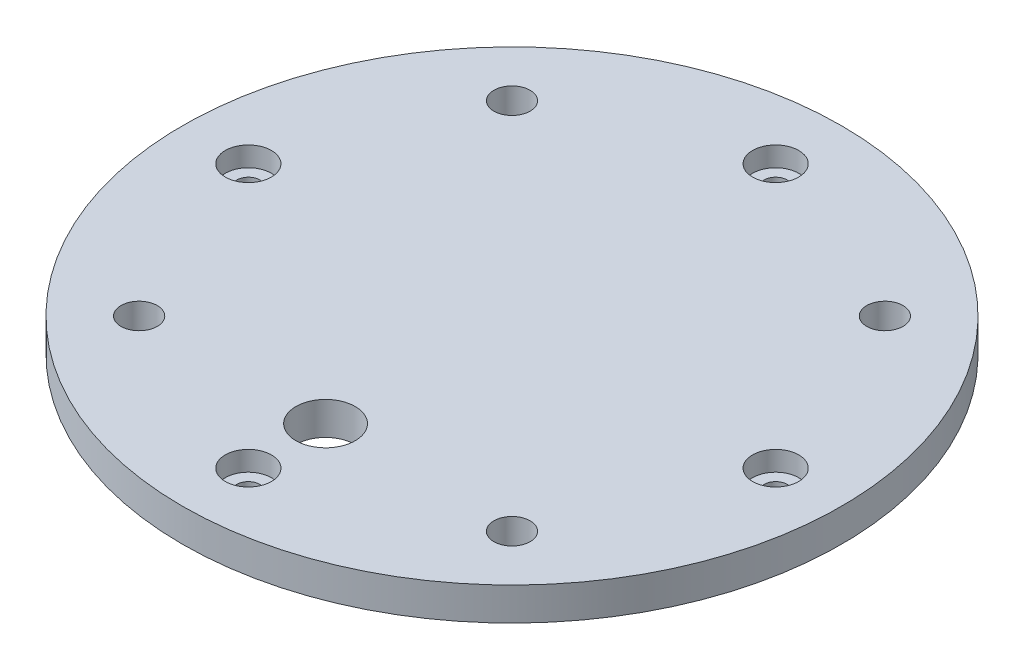
ISO-10303-21;
HEADER;
FILE_DESCRIPTION(('STEP AP214'),'2;1');
FILE_NAME('part.step','',(''),(''),'','','');
FILE_SCHEMA(('AUTOMOTIVE_DESIGN { 1 0 10303 214 1 1 1 1 }'));
ENDSEC;
DATA;
#1=APPLICATION_CONTEXT('core data for automotive mechanical design processes');
#2=APPLICATION_PROTOCOL_DEFINITION('international standard','automotive_design',2000,#1);
#3=PRODUCT_CONTEXT('',#1,'mechanical');
#4=PRODUCT('Part','Part','',(#3));
#5=PRODUCT_RELATED_PRODUCT_CATEGORY('part','',(#4));
#6=PRODUCT_DEFINITION_FORMATION('','',#4);
#7=PRODUCT_DEFINITION_CONTEXT('part definition',#1,'design');
#8=PRODUCT_DEFINITION('design','',#6,#7);
#9=PRODUCT_DEFINITION_SHAPE('','',#8);
#10=(LENGTH_UNIT() NAMED_UNIT(*) SI_UNIT(.MILLI.,.METRE.));
#11=(NAMED_UNIT(*) PLANE_ANGLE_UNIT() SI_UNIT($,.RADIAN.));
#12=(NAMED_UNIT(*) SI_UNIT($,.STERADIAN.) SOLID_ANGLE_UNIT());
#13=UNCERTAINTY_MEASURE_WITH_UNIT(LENGTH_MEASURE(1.E-05),#10,'distance_accuracy_value','');
#14=(GEOMETRIC_REPRESENTATION_CONTEXT(3) GLOBAL_UNCERTAINTY_ASSIGNED_CONTEXT((#13)) GLOBAL_UNIT_ASSIGNED_CONTEXT((#10,
#11,#12)) REPRESENTATION_CONTEXT('',''));
#15=CARTESIAN_POINT('',(0.,0.,0.));
#16=DIRECTION('',(0.,0.,1.));
#17=DIRECTION('',(1.,0.,0.));
#18=AXIS2_PLACEMENT_3D('',#15,#16,#17);
#19=CARTESIAN_POINT('',(-39.9999999999989,-7.,1.13441908361787E-12));
#20=DIRECTION('',(0.,1.,0.));
#21=DIRECTION('',(0.,0.,1.));
#22=AXIS2_PLACEMENT_3D('',#19,#20,#21);
#23=CYLINDRICAL_SURFACE('',#22,1.75000000000181);
#24=CARTESIAN_POINT('',(-39.9999999999989,0.,1.13441908361787E-12));
#25=DIRECTION('',(0.,1.,0.));
#26=DIRECTION('',(0.,0.,1.));
#27=AXIS2_PLACEMENT_3D('',#24,#25,#26);
#28=CIRCLE('',#27,1.75000000000181);
#29=CARTESIAN_POINT('',(-39.9999999999989,0.,1.75000000000295));
#30=VERTEX_POINT('',#29);
#31=EDGE_CURVE('E54',#30,#30,#28,.T.);
#32=ORIENTED_EDGE('',*,*,#31,.F.);
#33=EDGE_LOOP('',(#32));
#34=FACE_BOUND('',#33,.T.);
#35=CARTESIAN_POINT('',(-39.9999999999989,2.,1.13441908361787E-12));
#36=DIRECTION('',(0.,1.,0.));
#37=DIRECTION('',(0.,0.,1.));
#38=AXIS2_PLACEMENT_3D('',#35,#36,#37);
#39=CIRCLE('',#38,1.75000000000181);
#40=CARTESIAN_POINT('',(-39.9999999999989,2.,1.75000000000295));
#41=VERTEX_POINT('',#40);
#42=EDGE_CURVE('E58',#41,#41,#39,.F.);
#43=ORIENTED_EDGE('',*,*,#42,.F.);
#44=EDGE_LOOP('',(#43));
#45=FACE_BOUND('',#44,.T.);
#46=ADVANCED_FACE('F35',(#34,#45),#23,.F.);
#47=CARTESIAN_POINT('',(2.25904099284255E-12,-7.,40.));
#48=DIRECTION('',(0.,1.,0.));
#49=DIRECTION('',(0.,0.,1.));
#50=AXIS2_PLACEMENT_3D('',#47,#48,#49);
#51=CYLINDRICAL_SURFACE('',#50,1.75000000000243);
#52=CARTESIAN_POINT('',(2.25904099284255E-12,0.,40.));
#53=DIRECTION('',(0.,1.,0.));
#54=DIRECTION('',(0.,0.,1.));
#55=AXIS2_PLACEMENT_3D('',#52,#53,#54);
#56=CIRCLE('',#55,1.75000000000243);
#57=CARTESIAN_POINT('',(2.25904099284255E-12,0.,41.7500000000024));
#58=VERTEX_POINT('',#57);
#59=EDGE_CURVE('E57',#58,#58,#56,.T.);
#60=ORIENTED_EDGE('',*,*,#59,.F.);
#61=EDGE_LOOP('',(#60));
#62=FACE_BOUND('',#61,.T.);
#63=CARTESIAN_POINT('',(2.25904099284255E-12,2.,40.));
#64=DIRECTION('',(0.,1.,0.));
#65=DIRECTION('',(0.,0.,1.));
#66=AXIS2_PLACEMENT_3D('',#63,#64,#65);
#67=CIRCLE('',#66,1.75000000000243);
#68=CARTESIAN_POINT('',(2.25904099284255E-12,2.,41.7500000000024));
#69=VERTEX_POINT('',#68);
#70=EDGE_CURVE('E73',#69,#69,#67,.F.);
#71=ORIENTED_EDGE('',*,*,#70,.F.);
#72=EDGE_LOOP('',(#71));
#73=FACE_BOUND('',#72,.T.);
#74=ADVANCED_FACE('F148',(#62,#73),#51,.F.);
#75=CARTESIAN_POINT('',(40.0000000000011,-7.,-1.12952049642128E-12));
#76=DIRECTION('',(0.,1.,0.));
#77=DIRECTION('',(0.,0.,1.));
#78=AXIS2_PLACEMENT_3D('',#75,#76,#77);
#79=CYLINDRICAL_SURFACE('',#78,1.75000000000088);
#80=CARTESIAN_POINT('',(40.0000000000011,0.,-1.12952049642128E-12));
#81=DIRECTION('',(0.,1.,0.));
#82=DIRECTION('',(0.,0.,1.));
#83=AXIS2_PLACEMENT_3D('',#80,#81,#82);
#84=CIRCLE('',#83,1.75000000000088);
#85=CARTESIAN_POINT('',(40.0000000000011,0.,1.74999999999975));
#86=VERTEX_POINT('',#85);
#87=EDGE_CURVE('E61',#86,#86,#84,.T.);
#88=ORIENTED_EDGE('',*,*,#87,.F.);
#89=EDGE_LOOP('',(#88));
#90=FACE_BOUND('',#89,.T.);
#91=CARTESIAN_POINT('',(40.0000000000011,2.,-1.12952049642128E-12));
#92=DIRECTION('',(0.,1.,0.));
#93=DIRECTION('',(0.,0.,1.));
#94=AXIS2_PLACEMENT_3D('',#91,#92,#93);
#95=CIRCLE('',#94,1.75000000000088);
#96=CARTESIAN_POINT('',(40.0000000000011,2.,1.74999999999975));
#97=VERTEX_POINT('',#96);
#98=EDGE_CURVE('E69',#97,#97,#95,.F.);
#99=ORIENTED_EDGE('',*,*,#98,.F.);
#100=EDGE_LOOP('',(#99));
#101=FACE_BOUND('',#100,.T.);
#102=ADVANCED_FACE('F154',(#90,#101),#79,.F.);
#103=CARTESIAN_POINT('',(0.,-7.,-40.));
#104=DIRECTION('',(0.,1.,0.));
#105=DIRECTION('',(0.,0.,1.));
#106=AXIS2_PLACEMENT_3D('',#103,#104,#105);
#107=CYLINDRICAL_SURFACE('',#106,1.75);
#108=CARTESIAN_POINT('',(0.,0.,-40.));
#109=DIRECTION('',(0.,1.,0.));
#110=DIRECTION('',(0.,0.,1.));
#111=AXIS2_PLACEMENT_3D('',#108,#109,#110);
#112=CIRCLE('',#111,1.75);
#113=CARTESIAN_POINT('',(0.,0.,-38.25));
#114=VERTEX_POINT('',#113);
#115=EDGE_CURVE('E48',#114,#114,#112,.T.);
#116=ORIENTED_EDGE('',*,*,#115,.F.);
#117=EDGE_LOOP('',(#116));
#118=FACE_BOUND('',#117,.T.);
#119=CARTESIAN_POINT('',(0.,2.,-40.));
#120=DIRECTION('',(0.,1.,0.));
#121=DIRECTION('',(0.,0.,1.));
#122=AXIS2_PLACEMENT_3D('',#119,#120,#121);
#123=CIRCLE('',#122,1.75);
#124=CARTESIAN_POINT('',(0.,2.,-38.25));
#125=VERTEX_POINT('',#124);
#126=EDGE_CURVE('E66',#125,#125,#123,.F.);
#127=ORIENTED_EDGE('',*,*,#126,.F.);
#128=EDGE_LOOP('',(#127));
#129=FACE_BOUND('',#128,.T.);
#130=ADVANCED_FACE('F204',(#118,#129),#107,.F.);
#131=CARTESIAN_POINT('',(0.,5.,0.));
#132=DIRECTION('',(0.,-1.,0.));
#133=DIRECTION('',(0.,0.,-1.));
#134=AXIS2_PLACEMENT_3D('',#131,#132,#133);
#135=CYLINDRICAL_SURFACE('',#134,50.);
#136=CARTESIAN_POINT('',(0.,5.,0.));
#137=DIRECTION('',(0.,1.,0.));
#138=DIRECTION('',(0.,0.,1.));
#139=AXIS2_PLACEMENT_3D('',#136,#137,#138);
#140=CIRCLE('',#139,50.);
#141=CARTESIAN_POINT('',(0.,5.,50.));
#142=VERTEX_POINT('',#141);
#143=EDGE_CURVE('E10',#142,#142,#140,.T.);
#144=ORIENTED_EDGE('',*,*,#143,.F.);
#145=EDGE_LOOP('',(#144));
#146=FACE_BOUND('',#145,.T.);
#147=CARTESIAN_POINT('',(0.,0.,0.));
#148=DIRECTION('',(0.,1.,0.));
#149=DIRECTION('',(0.,0.,1.));
#150=AXIS2_PLACEMENT_3D('',#147,#148,#149);
#151=CIRCLE('',#150,50.);
#152=CARTESIAN_POINT('',(0.,0.,50.));
#153=VERTEX_POINT('',#152);
#154=EDGE_CURVE('E43',#153,#153,#151,.T.);
#155=ORIENTED_EDGE('',*,*,#154,.T.);
#156=EDGE_LOOP('',(#155));
#157=FACE_BOUND('',#156,.T.);
#158=ADVANCED_FACE('F37',(#146,#157),#135,.T.);
#159=CARTESIAN_POINT('',(0.,5.,0.));
#160=DIRECTION('',(0.,1.,0.));
#161=DIRECTION('',(0.,0.,1.));
#162=AXIS2_PLACEMENT_3D('',#159,#160,#161);
#163=PLANE('',#162);
#164=CARTESIAN_POINT('',(1.3765030781876E-12,5.,28.2842712474618));
#165=DIRECTION('',(0.,1.,0.));
#166=DIRECTION('',(0.,0.,1.));
#167=AXIS2_PLACEMENT_3D('',#164,#165,#166);
#168=CIRCLE('',#167,4.5);
#169=CARTESIAN_POINT('',(1.3765030781876E-12,5.,32.7842712474618));
#170=VERTEX_POINT('',#169);
#171=EDGE_CURVE('E127',#170,#170,#168,.T.);
#172=ORIENTED_EDGE('',*,*,#171,.F.);
#173=EDGE_LOOP('',(#172));
#174=FACE_BOUND('',#173,.T.);
#175=CARTESIAN_POINT('',(-28.2842712474616,5.,-28.2842712474622));
#176=DIRECTION('',(0.,1.,0.));
#177=DIRECTION('',(0.,0.,1.));
#178=AXIS2_PLACEMENT_3D('',#175,#176,#177);
#179=CIRCLE('',#178,2.75);
#180=CARTESIAN_POINT('',(-28.2842712474616,5.,-25.5342712474622));
#181=VERTEX_POINT('',#180);
#182=EDGE_CURVE('E119',#181,#181,#179,.T.);
#183=ORIENTED_EDGE('',*,*,#182,.F.);
#184=EDGE_LOOP('',(#183));
#185=FACE_BOUND('',#184,.T.);
#186=CARTESIAN_POINT('',(-28.2842712474621,5.,28.2842712474617));
#187=DIRECTION('',(0.,1.,0.));
#188=DIRECTION('',(0.,0.,1.));
#189=AXIS2_PLACEMENT_3D('',#186,#187,#188);
#190=CIRCLE('',#189,2.75);
#191=CARTESIAN_POINT('',(-28.2842712474621,5.,31.0342712474616));
#192=VERTEX_POINT('',#191);
#193=EDGE_CURVE('E122',#192,#192,#190,.T.);
#194=ORIENTED_EDGE('',*,*,#193,.F.);
#195=EDGE_LOOP('',(#194));
#196=FACE_BOUND('',#195,.T.);
#197=CARTESIAN_POINT('',(28.2842712474618,5.,28.284271247462));
#198=DIRECTION('',(0.,1.,0.));
#199=DIRECTION('',(0.,0.,1.));
#200=AXIS2_PLACEMENT_3D('',#197,#198,#199);
#201=CIRCLE('',#200,2.75);
#202=CARTESIAN_POINT('',(28.2842712474618,5.,31.034271247462));
#203=VERTEX_POINT('',#202);
#204=EDGE_CURVE('E118',#203,#203,#201,.T.);
#205=ORIENTED_EDGE('',*,*,#204,.F.);
#206=EDGE_LOOP('',(#205));
#207=FACE_BOUND('',#206,.T.);
#208=CARTESIAN_POINT('',(28.2842712474619,5.,-28.2842712474619));
#209=DIRECTION('',(0.,1.,0.));
#210=DIRECTION('',(0.,0.,1.));
#211=AXIS2_PLACEMENT_3D('',#208,#209,#210);
#212=CIRCLE('',#211,2.75);
#213=CARTESIAN_POINT('',(28.2842712474619,5.,-25.5342712474619));
#214=VERTEX_POINT('',#213);
#215=EDGE_CURVE('E82',#214,#214,#212,.T.);
#216=ORIENTED_EDGE('',*,*,#215,.F.);
#217=EDGE_LOOP('',(#216));
#218=FACE_BOUND('',#217,.T.);
#219=CARTESIAN_POINT('',(0.,5.,-40.0000000000001));
#220=DIRECTION('',(0.,1.,0.));
#221=DIRECTION('',(0.,0.,1.));
#222=AXIS2_PLACEMENT_3D('',#219,#220,#221);
#223=CIRCLE('',#222,3.5);
#224=CARTESIAN_POINT('',(0.,5.,-36.5000000000001));
#225=VERTEX_POINT('',#224);
#226=EDGE_CURVE('E111',#225,#225,#223,.T.);
#227=ORIENTED_EDGE('',*,*,#226,.F.);
#228=EDGE_LOOP('',(#227));
#229=FACE_BOUND('',#228,.T.);
#230=CARTESIAN_POINT('',(40.0000000000013,5.,-1.10703848017262E-12));
#231=DIRECTION('',(0.,1.,0.));
#232=DIRECTION('',(0.,0.,1.));
#233=AXIS2_PLACEMENT_3D('',#230,#231,#232);
#234=CIRCLE('',#233,3.5);
#235=CARTESIAN_POINT('',(40.0000000000013,5.,3.49999999999889));
#236=VERTEX_POINT('',#235);
#237=EDGE_CURVE('E108',#236,#236,#234,.T.);
#238=ORIENTED_EDGE('',*,*,#237,.F.);
#239=EDGE_LOOP('',(#238));
#240=FACE_BOUND('',#239,.T.);
#241=CARTESIAN_POINT('',(2.21407696034524E-12,5.,40.0000000000001));
#242=DIRECTION('',(0.,1.,0.));
#243=DIRECTION('',(0.,0.,1.));
#244=AXIS2_PLACEMENT_3D('',#241,#242,#243);
#245=CIRCLE('',#244,3.5);
#246=CARTESIAN_POINT('',(2.21407696034524E-12,5.,43.5000000000001));
#247=VERTEX_POINT('',#246);
#248=EDGE_CURVE('E100',#247,#247,#245,.T.);
#249=ORIENTED_EDGE('',*,*,#248,.F.);
#250=EDGE_LOOP('',(#249));
#251=FACE_BOUND('',#250,.T.);
#252=CARTESIAN_POINT('',(-39.999999999999,5.,1.11193706736921E-12));
#253=DIRECTION('',(0.,1.,0.));
#254=DIRECTION('',(0.,0.,1.));
#255=AXIS2_PLACEMENT_3D('',#252,#253,#254);
#256=CIRCLE('',#255,3.5);
#257=CARTESIAN_POINT('',(-39.999999999999,5.,3.50000000000111));
#258=VERTEX_POINT('',#257);
#259=EDGE_CURVE('E92',#258,#258,#256,.T.);
#260=ORIENTED_EDGE('',*,*,#259,.F.);
#261=EDGE_LOOP('',(#260));
#262=FACE_BOUND('',#261,.T.);
#263=ORIENTED_EDGE('',*,*,#143,.T.);
#264=EDGE_LOOP('',(#263));
#265=FACE_BOUND('',#264,.T.);
#266=ADVANCED_FACE('F161',(#174,#185,#196,#207,#218,#229,#240,#251,#262,#265),#163,.T.);
#267=CARTESIAN_POINT('',(0.,0.,0.));
#268=DIRECTION('',(0.,1.,0.));
#269=DIRECTION('',(0.,0.,1.));
#270=AXIS2_PLACEMENT_3D('',#267,#268,#269);
#271=PLANE('',#270);
#272=CARTESIAN_POINT('',(1.3765030781876E-12,0.,28.2842712474618));
#273=DIRECTION('',(0.,1.,0.));
#274=DIRECTION('',(0.,0.,1.));
#275=AXIS2_PLACEMENT_3D('',#272,#273,#274);
#276=CIRCLE('',#275,4.5);
#277=CARTESIAN_POINT('',(1.3765030781876E-12,0.,32.7842712474618));
#278=VERTEX_POINT('',#277);
#279=EDGE_CURVE('E39',#278,#278,#276,.T.);
#280=ORIENTED_EDGE('',*,*,#279,.T.);
#281=EDGE_LOOP('',(#280));
#282=FACE_BOUND('',#281,.T.);
#283=CARTESIAN_POINT('',(-28.2842712474616,0.,-28.2842712474622));
#284=DIRECTION('',(0.,1.,0.));
#285=DIRECTION('',(0.,0.,1.));
#286=AXIS2_PLACEMENT_3D('',#283,#284,#285);
#287=CIRCLE('',#286,2.75);
#288=CARTESIAN_POINT('',(-28.2842712474616,0.,-25.5342712474622));
#289=VERTEX_POINT('',#288);
#290=EDGE_CURVE('E87',#289,#289,#287,.T.);
#291=ORIENTED_EDGE('',*,*,#290,.T.);
#292=EDGE_LOOP('',(#291));
#293=FACE_BOUND('',#292,.T.);
#294=CARTESIAN_POINT('',(-28.2842712474621,0.,28.2842712474617));
#295=DIRECTION('',(0.,1.,0.));
#296=DIRECTION('',(0.,0.,1.));
#297=AXIS2_PLACEMENT_3D('',#294,#295,#296);
#298=CIRCLE('',#297,2.75);
#299=CARTESIAN_POINT('',(-28.2842712474621,0.,31.0342712474616));
#300=VERTEX_POINT('',#299);
#301=EDGE_CURVE('E85',#300,#300,#298,.T.);
#302=ORIENTED_EDGE('',*,*,#301,.T.);
#303=EDGE_LOOP('',(#302));
#304=FACE_BOUND('',#303,.T.);
#305=CARTESIAN_POINT('',(28.2842712474618,0.,28.284271247462));
#306=DIRECTION('',(0.,1.,0.));
#307=DIRECTION('',(0.,0.,1.));
#308=AXIS2_PLACEMENT_3D('',#305,#306,#307);
#309=CIRCLE('',#308,2.75);
#310=CARTESIAN_POINT('',(28.2842712474618,0.,31.034271247462));
#311=VERTEX_POINT('',#310);
#312=EDGE_CURVE('E81',#311,#311,#309,.T.);
#313=ORIENTED_EDGE('',*,*,#312,.T.);
#314=EDGE_LOOP('',(#313));
#315=FACE_BOUND('',#314,.T.);
#316=CARTESIAN_POINT('',(28.2842712474619,0.,-28.2842712474619));
#317=DIRECTION('',(0.,1.,0.));
#318=DIRECTION('',(0.,0.,1.));
#319=AXIS2_PLACEMENT_3D('',#316,#317,#318);
#320=CIRCLE('',#319,2.75);
#321=CARTESIAN_POINT('',(28.2842712474619,0.,-25.5342712474619));
#322=VERTEX_POINT('',#321);
#323=EDGE_CURVE('E78',#322,#322,#320,.T.);
#324=ORIENTED_EDGE('',*,*,#323,.T.);
#325=EDGE_LOOP('',(#324));
#326=FACE_BOUND('',#325,.T.);
#327=ORIENTED_EDGE('',*,*,#115,.T.);
#328=EDGE_LOOP('',(#327));
#329=FACE_BOUND('',#328,.T.);
#330=ORIENTED_EDGE('',*,*,#87,.T.);
#331=EDGE_LOOP('',(#330));
#332=FACE_BOUND('',#331,.T.);
#333=ORIENTED_EDGE('',*,*,#59,.T.);
#334=EDGE_LOOP('',(#333));
#335=FACE_BOUND('',#334,.T.);
#336=ORIENTED_EDGE('',*,*,#31,.T.);
#337=EDGE_LOOP('',(#336));
#338=FACE_BOUND('',#337,.T.);
#339=ORIENTED_EDGE('',*,*,#154,.F.);
#340=EDGE_LOOP('',(#339));
#341=FACE_BOUND('',#340,.T.);
#342=ADVANCED_FACE('F134',(#282,#293,#304,#315,#326,#329,#332,#335,#338,#341),#271,.F.);
#343=CARTESIAN_POINT('',(0.,2.,-40.0000000000001));
#344=DIRECTION('',(0.,1.,0.));
#345=DIRECTION('',(0.,0.,1.));
#346=AXIS2_PLACEMENT_3D('',#343,#344,#345);
#347=PLANE('',#346);
#348=CARTESIAN_POINT('',(0.,2.,-40.0000000000001));
#349=DIRECTION('',(0.,1.,0.));
#350=DIRECTION('',(0.,0.,1.));
#351=AXIS2_PLACEMENT_3D('',#348,#349,#350);
#352=CIRCLE('',#351,3.5);
#353=CARTESIAN_POINT('',(0.,2.,-36.5000000000001));
#354=VERTEX_POINT('',#353);
#355=EDGE_CURVE('E70',#354,#354,#352,.T.);
#356=ORIENTED_EDGE('',*,*,#355,.T.);
#357=EDGE_LOOP('',(#356));
#358=FACE_BOUND('',#357,.T.);
#359=ORIENTED_EDGE('',*,*,#126,.T.);
#360=EDGE_LOOP('',(#359));
#361=FACE_BOUND('',#360,.T.);
#362=ADVANCED_FACE('F165',(#358,#361),#347,.T.);
#363=CARTESIAN_POINT('',(0.,2.,-40.0000000000001));
#364=DIRECTION('',(0.,1.,0.));
#365=DIRECTION('',(0.,0.,1.));
#366=AXIS2_PLACEMENT_3D('',#363,#364,#365);
#367=CYLINDRICAL_SURFACE('',#366,3.5);
#368=ORIENTED_EDGE('',*,*,#355,.F.);
#369=EDGE_LOOP('',(#368));
#370=FACE_BOUND('',#369,.T.);
#371=ORIENTED_EDGE('',*,*,#226,.T.);
#372=EDGE_LOOP('',(#371));
#373=FACE_BOUND('',#372,.T.);
#374=ADVANCED_FACE('F169',(#370,#373),#367,.F.);
#375=CARTESIAN_POINT('',(40.0000000000013,2.,-1.10703848017262E-12));
#376=DIRECTION('',(0.,1.,0.));
#377=DIRECTION('',(0.,0.,1.));
#378=AXIS2_PLACEMENT_3D('',#375,#376,#377);
#379=PLANE('',#378);
#380=CARTESIAN_POINT('',(40.0000000000013,2.,-1.10703848017262E-12));
#381=DIRECTION('',(0.,1.,0.));
#382=DIRECTION('',(0.,0.,1.));
#383=AXIS2_PLACEMENT_3D('',#380,#381,#382);
#384=CIRCLE('',#383,3.5);
#385=CARTESIAN_POINT('',(40.0000000000013,2.,3.49999999999889));
#386=VERTEX_POINT('',#385);
#387=EDGE_CURVE('E105',#386,#386,#384,.T.);
#388=ORIENTED_EDGE('',*,*,#387,.T.);
#389=EDGE_LOOP('',(#388));
#390=FACE_BOUND('',#389,.T.);
#391=ORIENTED_EDGE('',*,*,#98,.T.);
#392=EDGE_LOOP('',(#391));
#393=FACE_BOUND('',#392,.T.);
#394=ADVANCED_FACE('F175',(#390,#393),#379,.T.);
#395=CARTESIAN_POINT('',(40.0000000000013,2.,-1.10703848017262E-12));
#396=DIRECTION('',(0.,1.,0.));
#397=DIRECTION('',(0.,0.,1.));
#398=AXIS2_PLACEMENT_3D('',#395,#396,#397);
#399=CYLINDRICAL_SURFACE('',#398,3.5);
#400=ORIENTED_EDGE('',*,*,#387,.F.);
#401=EDGE_LOOP('',(#400));
#402=FACE_BOUND('',#401,.T.);
#403=ORIENTED_EDGE('',*,*,#237,.T.);
#404=EDGE_LOOP('',(#403));
#405=FACE_BOUND('',#404,.T.);
#406=ADVANCED_FACE('F182',(#402,#405),#399,.F.);
#407=CARTESIAN_POINT('',(2.21407696034524E-12,2.,40.0000000000001));
#408=DIRECTION('',(0.,1.,0.));
#409=DIRECTION('',(0.,0.,1.));
#410=AXIS2_PLACEMENT_3D('',#407,#408,#409);
#411=PLANE('',#410);
#412=CARTESIAN_POINT('',(2.21407696034524E-12,2.,40.0000000000001));
#413=DIRECTION('',(0.,1.,0.));
#414=DIRECTION('',(0.,0.,1.));
#415=AXIS2_PLACEMENT_3D('',#412,#413,#414);
#416=CIRCLE('',#415,3.5);
#417=CARTESIAN_POINT('',(2.21407696034524E-12,2.,43.5000000000001));
#418=VERTEX_POINT('',#417);
#419=EDGE_CURVE('E96',#418,#418,#416,.T.);
#420=ORIENTED_EDGE('',*,*,#419,.T.);
#421=EDGE_LOOP('',(#420));
#422=FACE_BOUND('',#421,.T.);
#423=ORIENTED_EDGE('',*,*,#70,.T.);
#424=EDGE_LOOP('',(#423));
#425=FACE_BOUND('',#424,.T.);
#426=ADVANCED_FACE('F185',(#422,#425),#411,.T.);
#427=CARTESIAN_POINT('',(2.21407696034524E-12,2.,40.0000000000001));
#428=DIRECTION('',(0.,1.,0.));
#429=DIRECTION('',(0.,0.,1.));
#430=AXIS2_PLACEMENT_3D('',#427,#428,#429);
#431=CYLINDRICAL_SURFACE('',#430,3.5);
#432=ORIENTED_EDGE('',*,*,#419,.F.);
#433=EDGE_LOOP('',(#432));
#434=FACE_BOUND('',#433,.T.);
#435=ORIENTED_EDGE('',*,*,#248,.T.);
#436=EDGE_LOOP('',(#435));
#437=FACE_BOUND('',#436,.T.);
#438=ADVANCED_FACE('F190',(#434,#437),#431,.F.);
#439=CARTESIAN_POINT('',(-39.999999999999,2.,1.11193706736921E-12));
#440=DIRECTION('',(0.,1.,0.));
#441=DIRECTION('',(0.,0.,1.));
#442=AXIS2_PLACEMENT_3D('',#439,#440,#441);
#443=PLANE('',#442);
#444=CARTESIAN_POINT('',(-39.999999999999,2.,1.11193706736921E-12));
#445=DIRECTION('',(0.,1.,0.));
#446=DIRECTION('',(0.,0.,1.));
#447=AXIS2_PLACEMENT_3D('',#444,#445,#446);
#448=CIRCLE('',#447,3.5);
#449=CARTESIAN_POINT('',(-39.999999999999,2.,3.50000000000111));
#450=VERTEX_POINT('',#449);
#451=EDGE_CURVE('E51',#450,#450,#448,.T.);
#452=ORIENTED_EDGE('',*,*,#451,.T.);
#453=EDGE_LOOP('',(#452));
#454=FACE_BOUND('',#453,.T.);
#455=ORIENTED_EDGE('',*,*,#42,.T.);
#456=EDGE_LOOP('',(#455));
#457=FACE_BOUND('',#456,.T.);
#458=ADVANCED_FACE('F193',(#454,#457),#443,.T.);
#459=CARTESIAN_POINT('',(-39.999999999999,2.,1.11193706736921E-12));
#460=DIRECTION('',(0.,1.,0.));
#461=DIRECTION('',(0.,0.,1.));
#462=AXIS2_PLACEMENT_3D('',#459,#460,#461);
#463=CYLINDRICAL_SURFACE('',#462,3.5);
#464=ORIENTED_EDGE('',*,*,#451,.F.);
#465=EDGE_LOOP('',(#464));
#466=FACE_BOUND('',#465,.T.);
#467=ORIENTED_EDGE('',*,*,#259,.T.);
#468=EDGE_LOOP('',(#467));
#469=FACE_BOUND('',#468,.T.);
#470=ADVANCED_FACE('F198',(#466,#469),#463,.F.);
#471=CARTESIAN_POINT('',(28.2842712474619,-19.,-28.2842712474619));
#472=DIRECTION('',(0.,1.,0.));
#473=DIRECTION('',(0.,0.,1.));
#474=AXIS2_PLACEMENT_3D('',#471,#472,#473);
#475=CYLINDRICAL_SURFACE('',#474,2.75);
#476=ORIENTED_EDGE('',*,*,#215,.T.);
#477=EDGE_LOOP('',(#476));
#478=FACE_BOUND('',#477,.T.);
#479=ORIENTED_EDGE('',*,*,#323,.F.);
#480=EDGE_LOOP('',(#479));
#481=FACE_BOUND('',#480,.T.);
#482=ADVANCED_FACE('F180',(#478,#481),#475,.F.);
#483=CARTESIAN_POINT('',(28.2842712474618,-19.,28.284271247462));
#484=DIRECTION('',(0.,1.,0.));
#485=DIRECTION('',(0.,0.,1.));
#486=AXIS2_PLACEMENT_3D('',#483,#484,#485);
#487=CYLINDRICAL_SURFACE('',#486,2.75);
#488=ORIENTED_EDGE('',*,*,#204,.T.);
#489=EDGE_LOOP('',(#488));
#490=FACE_BOUND('',#489,.T.);
#491=ORIENTED_EDGE('',*,*,#312,.F.);
#492=EDGE_LOOP('',(#491));
#493=FACE_BOUND('',#492,.T.);
#494=ADVANCED_FACE('F327',(#490,#493),#487,.F.);
#495=CARTESIAN_POINT('',(-28.2842712474621,-19.,28.2842712474617));
#496=DIRECTION('',(0.,1.,0.));
#497=DIRECTION('',(0.,0.,1.));
#498=AXIS2_PLACEMENT_3D('',#495,#496,#497);
#499=CYLINDRICAL_SURFACE('',#498,2.75);
#500=ORIENTED_EDGE('',*,*,#193,.T.);
#501=EDGE_LOOP('',(#500));
#502=FACE_BOUND('',#501,.T.);
#503=ORIENTED_EDGE('',*,*,#301,.F.);
#504=EDGE_LOOP('',(#503));
#505=FACE_BOUND('',#504,.T.);
#506=ADVANCED_FACE('F143',(#502,#505),#499,.F.);
#507=CARTESIAN_POINT('',(-28.2842712474616,-19.,-28.2842712474622));
#508=DIRECTION('',(0.,1.,0.));
#509=DIRECTION('',(0.,0.,1.));
#510=AXIS2_PLACEMENT_3D('',#507,#508,#509);
#511=CYLINDRICAL_SURFACE('',#510,2.75);
#512=ORIENTED_EDGE('',*,*,#182,.T.);
#513=EDGE_LOOP('',(#512));
#514=FACE_BOUND('',#513,.T.);
#515=ORIENTED_EDGE('',*,*,#290,.F.);
#516=EDGE_LOOP('',(#515));
#517=FACE_BOUND('',#516,.T.);
#518=ADVANCED_FACE('F138',(#514,#517),#511,.F.);
#519=CARTESIAN_POINT('',(1.3765030781876E-12,-11.,28.2842712474618));
#520=DIRECTION('',(0.,1.,0.));
#521=DIRECTION('',(0.,0.,1.));
#522=AXIS2_PLACEMENT_3D('',#519,#520,#521);
#523=CYLINDRICAL_SURFACE('',#522,4.5);
#524=ORIENTED_EDGE('',*,*,#171,.T.);
#525=EDGE_LOOP('',(#524));
#526=FACE_BOUND('',#525,.T.);
#527=ORIENTED_EDGE('',*,*,#279,.F.);
#528=EDGE_LOOP('',(#527));
#529=FACE_BOUND('',#528,.T.);
#530=ADVANCED_FACE('F136',(#526,#529),#523,.F.);
#531=CLOSED_SHELL('',(#46,#74,#102,#130,#158,#266,#342,#362,#374,#394,#406,#426,#438,#458,#470,
#482,#494,#506,#518,#530));
#532=MANIFOLD_SOLID_BREP('B2',#531);
#533=ADVANCED_BREP_SHAPE_REPRESENTATION('',(#18,#532),#14);
#534=SHAPE_DEFINITION_REPRESENTATION(#9,#533);
ENDSEC;
END-ISO-10303-21;
